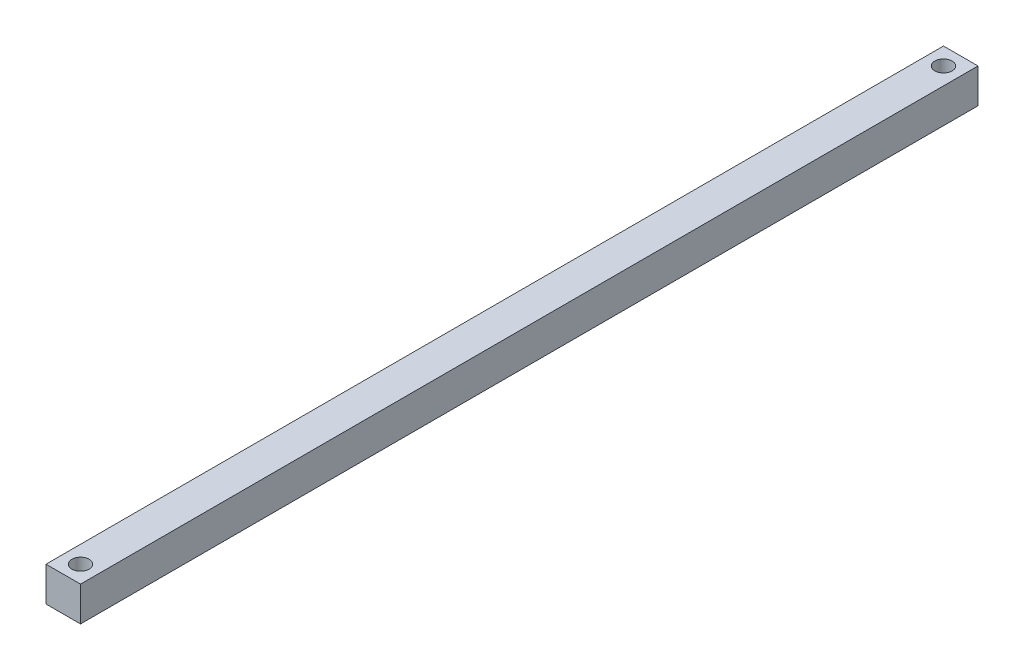
ISO-10303-21;
HEADER;
FILE_DESCRIPTION(('STEP AP214'),'2;1');
FILE_NAME('part.step','',(''),(''),'','','');
FILE_SCHEMA(('AUTOMOTIVE_DESIGN { 1 0 10303 214 1 1 1 1 }'));
ENDSEC;
DATA;
#1=APPLICATION_CONTEXT('core data for automotive mechanical design processes');
#2=APPLICATION_PROTOCOL_DEFINITION('international standard','automotive_design',2000,#1);
#3=PRODUCT_CONTEXT('',#1,'mechanical');
#4=PRODUCT('Part','Part','',(#3));
#5=PRODUCT_RELATED_PRODUCT_CATEGORY('part','',(#4));
#6=PRODUCT_DEFINITION_FORMATION('','',#4);
#7=PRODUCT_DEFINITION_CONTEXT('part definition',#1,'design');
#8=PRODUCT_DEFINITION('design','',#6,#7);
#9=PRODUCT_DEFINITION_SHAPE('','',#8);
#10=(LENGTH_UNIT() NAMED_UNIT(*) SI_UNIT(.MILLI.,.METRE.));
#11=(NAMED_UNIT(*) PLANE_ANGLE_UNIT() SI_UNIT($,.RADIAN.));
#12=(NAMED_UNIT(*) SI_UNIT($,.STERADIAN.) SOLID_ANGLE_UNIT());
#13=UNCERTAINTY_MEASURE_WITH_UNIT(LENGTH_MEASURE(1.E-05),#10,'distance_accuracy_value','');
#14=(GEOMETRIC_REPRESENTATION_CONTEXT(3) GLOBAL_UNCERTAINTY_ASSIGNED_CONTEXT((#13)) GLOBAL_UNIT_ASSIGNED_CONTEXT((#10,
#11,#12)) REPRESENTATION_CONTEXT('',''));
#15=CARTESIAN_POINT('',(0.,0.,0.));
#16=DIRECTION('',(0.,0.,1.));
#17=DIRECTION('',(1.,0.,0.));
#18=AXIS2_PLACEMENT_3D('',#15,#16,#17);
#19=CARTESIAN_POINT('',(0.,10.,0.));
#20=DIRECTION('',(-1.,0.,0.));
#21=DIRECTION('',(0.,0.,1.));
#22=AXIS2_PLACEMENT_3D('',#19,#20,#21);
#23=PLANE('',#22);
#24=DIRECTION('',(0.,0.,-1.));
#25=VECTOR('',#24,1.);
#26=CARTESIAN_POINT('',(0.,0.,0.));
#27=LINE('',#26,#25);
#28=CARTESIAN_POINT('',(0.,0.,0.));
#29=VERTEX_POINT('',#28);
#30=CARTESIAN_POINT('',(0.,0.,-260.));
#31=VERTEX_POINT('',#30);
#32=EDGE_CURVE('E95',#29,#31,#27,.T.);
#33=ORIENTED_EDGE('',*,*,#32,.T.);
#34=DIRECTION('',(0.,-1.,0.));
#35=VECTOR('',#34,1.);
#36=CARTESIAN_POINT('',(0.,10.,-260.));
#37=LINE('',#36,#35);
#38=CARTESIAN_POINT('',(0.,10.,-260.));
#39=VERTEX_POINT('',#38);
#40=EDGE_CURVE('E11',#39,#31,#37,.T.);
#41=ORIENTED_EDGE('',*,*,#40,.F.);
#42=DIRECTION('',(0.,0.,-1.));
#43=VECTOR('',#42,1.);
#44=CARTESIAN_POINT('',(0.,10.,0.));
#45=LINE('',#44,#43);
#46=CARTESIAN_POINT('',(0.,10.,0.));
#47=VERTEX_POINT('',#46);
#48=EDGE_CURVE('E83',#47,#39,#45,.T.);
#49=ORIENTED_EDGE('',*,*,#48,.F.);
#50=DIRECTION('',(0.,-1.,0.));
#51=VECTOR('',#50,1.);
#52=CARTESIAN_POINT('',(0.,10.,0.));
#53=LINE('',#52,#51);
#54=EDGE_CURVE('E91',#47,#29,#53,.T.);
#55=ORIENTED_EDGE('',*,*,#54,.T.);
#56=EDGE_LOOP('',(#33,#41,#49,#55));
#57=FACE_BOUND('',#56,.T.);
#58=ADVANCED_FACE('F32',(#57),#23,.F.);
#59=CARTESIAN_POINT('',(0.,10.,-260.));
#60=DIRECTION('',(0.,0.,1.));
#61=DIRECTION('',(1.,0.,0.));
#62=AXIS2_PLACEMENT_3D('',#59,#60,#61);
#63=PLANE('',#62);
#64=DIRECTION('',(-1.,0.,0.));
#65=VECTOR('',#64,1.);
#66=CARTESIAN_POINT('',(0.,0.,-260.));
#67=LINE('',#66,#65);
#68=CARTESIAN_POINT('',(-10.,0.,-260.));
#69=VERTEX_POINT('',#68);
#70=EDGE_CURVE('E87',#31,#69,#67,.T.);
#71=ORIENTED_EDGE('',*,*,#70,.T.);
#72=DIRECTION('',(0.,-1.,0.));
#73=VECTOR('',#72,1.);
#74=CARTESIAN_POINT('',(-10.,10.,-260.));
#75=LINE('',#74,#73);
#76=CARTESIAN_POINT('',(-10.,10.,-260.));
#77=VERTEX_POINT('',#76);
#78=EDGE_CURVE('E40',#77,#69,#75,.T.);
#79=ORIENTED_EDGE('',*,*,#78,.F.);
#80=DIRECTION('',(-1.,0.,0.));
#81=VECTOR('',#80,1.);
#82=CARTESIAN_POINT('',(0.,10.,-260.));
#83=LINE('',#82,#81);
#84=EDGE_CURVE('E78',#39,#77,#83,.T.);
#85=ORIENTED_EDGE('',*,*,#84,.F.);
#86=ORIENTED_EDGE('',*,*,#40,.T.);
#87=EDGE_LOOP('',(#71,#79,#85,#86));
#88=FACE_BOUND('',#87,.T.);
#89=ADVANCED_FACE('F86',(#88),#63,.F.);
#90=CARTESIAN_POINT('',(-10.,10.,0.));
#91=DIRECTION('',(1.,0.,0.));
#92=DIRECTION('',(0.,0.,-1.));
#93=AXIS2_PLACEMENT_3D('',#90,#91,#92);
#94=PLANE('',#93);
#95=DIRECTION('',(0.,0.,1.));
#96=VECTOR('',#95,1.);
#97=CARTESIAN_POINT('',(-10.,0.,0.));
#98=LINE('',#97,#96);
#99=CARTESIAN_POINT('',(-10.,0.,0.));
#100=VERTEX_POINT('',#99);
#101=EDGE_CURVE('E65',#69,#100,#98,.T.);
#102=ORIENTED_EDGE('',*,*,#101,.T.);
#103=DIRECTION('',(0.,-1.,0.));
#104=VECTOR('',#103,1.);
#105=CARTESIAN_POINT('',(-10.,10.,0.));
#106=LINE('',#105,#104);
#107=CARTESIAN_POINT('',(-10.,10.,0.));
#108=VERTEX_POINT('',#107);
#109=EDGE_CURVE('E88',#108,#100,#106,.T.);
#110=ORIENTED_EDGE('',*,*,#109,.F.);
#111=DIRECTION('',(0.,0.,1.));
#112=VECTOR('',#111,1.);
#113=CARTESIAN_POINT('',(-10.,10.,0.));
#114=LINE('',#113,#112);
#115=EDGE_CURVE('E81',#77,#108,#114,.T.);
#116=ORIENTED_EDGE('',*,*,#115,.F.);
#117=ORIENTED_EDGE('',*,*,#78,.T.);
#118=EDGE_LOOP('',(#102,#110,#116,#117));
#119=FACE_BOUND('',#118,.T.);
#120=ADVANCED_FACE('F89',(#119),#94,.F.);
#121=CARTESIAN_POINT('',(0.,10.,0.));
#122=DIRECTION('',(0.,0.,-1.));
#123=DIRECTION('',(-1.,0.,0.));
#124=AXIS2_PLACEMENT_3D('',#121,#122,#123);
#125=PLANE('',#124);
#126=DIRECTION('',(1.,0.,0.));
#127=VECTOR('',#126,1.);
#128=CARTESIAN_POINT('',(0.,0.,0.));
#129=LINE('',#128,#127);
#130=EDGE_CURVE('E71',#100,#29,#129,.T.);
#131=ORIENTED_EDGE('',*,*,#130,.T.);
#132=ORIENTED_EDGE('',*,*,#54,.F.);
#133=DIRECTION('',(1.,0.,0.));
#134=VECTOR('',#133,1.);
#135=CARTESIAN_POINT('',(0.,10.,0.));
#136=LINE('',#135,#134);
#137=EDGE_CURVE('E48',#108,#47,#136,.T.);
#138=ORIENTED_EDGE('',*,*,#137,.F.);
#139=ORIENTED_EDGE('',*,*,#109,.T.);
#140=EDGE_LOOP('',(#131,#132,#138,#139));
#141=FACE_BOUND('',#140,.T.);
#142=ADVANCED_FACE('F103',(#141),#125,.F.);
#143=CARTESIAN_POINT('',(0.,10.,0.));
#144=DIRECTION('',(0.,1.,0.));
#145=DIRECTION('',(0.,0.,1.));
#146=AXIS2_PLACEMENT_3D('',#143,#144,#145);
#147=PLANE('',#146);
#148=CARTESIAN_POINT('',(-5.,10.,-5.));
#149=DIRECTION('',(0.,1.,0.));
#150=DIRECTION('',(0.,0.,1.));
#151=AXIS2_PLACEMENT_3D('',#148,#149,#150);
#152=CIRCLE('',#151,2.5);
#153=CARTESIAN_POINT('',(-5.,10.,-2.5));
#154=VERTEX_POINT('',#153);
#155=EDGE_CURVE('E115',#154,#154,#152,.T.);
#156=ORIENTED_EDGE('',*,*,#155,.F.);
#157=EDGE_LOOP('',(#156));
#158=FACE_BOUND('',#157,.T.);
#159=CARTESIAN_POINT('',(-5.,10.,-255.));
#160=DIRECTION('',(0.,1.,0.));
#161=DIRECTION('',(0.,0.,1.));
#162=AXIS2_PLACEMENT_3D('',#159,#160,#161);
#163=CIRCLE('',#162,2.5);
#164=CARTESIAN_POINT('',(-5.,10.,-252.5));
#165=VERTEX_POINT('',#164);
#166=EDGE_CURVE('E109',#165,#165,#163,.T.);
#167=ORIENTED_EDGE('',*,*,#166,.F.);
#168=EDGE_LOOP('',(#167));
#169=FACE_BOUND('',#168,.T.);
#170=ORIENTED_EDGE('',*,*,#48,.T.);
#171=ORIENTED_EDGE('',*,*,#84,.T.);
#172=ORIENTED_EDGE('',*,*,#115,.T.);
#173=ORIENTED_EDGE('',*,*,#137,.T.);
#174=EDGE_LOOP('',(#170,#171,#172,#173));
#175=FACE_BOUND('',#174,.T.);
#176=ADVANCED_FACE('F79',(#158,#169,#175),#147,.T.);
#177=CARTESIAN_POINT('',(0.,0.,0.));
#178=DIRECTION('',(0.,1.,0.));
#179=DIRECTION('',(0.,0.,1.));
#180=AXIS2_PLACEMENT_3D('',#177,#178,#179);
#181=PLANE('',#180);
#182=CARTESIAN_POINT('',(-5.,0.,-5.));
#183=DIRECTION('',(0.,1.,0.));
#184=DIRECTION('',(0.,0.,1.));
#185=AXIS2_PLACEMENT_3D('',#182,#183,#184);
#186=CIRCLE('',#185,2.5);
#187=CARTESIAN_POINT('',(-5.,0.,-2.5));
#188=VERTEX_POINT('',#187);
#189=EDGE_CURVE('E112',#188,#188,#186,.T.);
#190=ORIENTED_EDGE('',*,*,#189,.T.);
#191=EDGE_LOOP('',(#190));
#192=FACE_BOUND('',#191,.T.);
#193=CARTESIAN_POINT('',(-5.,0.,-255.));
#194=DIRECTION('',(0.,1.,0.));
#195=DIRECTION('',(0.,0.,1.));
#196=AXIS2_PLACEMENT_3D('',#193,#194,#195);
#197=CIRCLE('',#196,2.5);
#198=CARTESIAN_POINT('',(-5.,0.,-252.5));
#199=VERTEX_POINT('',#198);
#200=EDGE_CURVE('E98',#199,#199,#197,.T.);
#201=ORIENTED_EDGE('',*,*,#200,.T.);
#202=EDGE_LOOP('',(#201));
#203=FACE_BOUND('',#202,.T.);
#204=ORIENTED_EDGE('',*,*,#32,.F.);
#205=ORIENTED_EDGE('',*,*,#130,.F.);
#206=ORIENTED_EDGE('',*,*,#101,.F.);
#207=ORIENTED_EDGE('',*,*,#70,.F.);
#208=EDGE_LOOP('',(#204,#205,#206,#207));
#209=FACE_BOUND('',#208,.T.);
#210=ADVANCED_FACE('F106',(#192,#203,#209),#181,.F.);
#211=CARTESIAN_POINT('',(-5.,0.,-255.));
#212=DIRECTION('',(0.,1.,0.));
#213=DIRECTION('',(0.,0.,1.));
#214=AXIS2_PLACEMENT_3D('',#211,#212,#213);
#215=CYLINDRICAL_SURFACE('',#214,2.5);
#216=ORIENTED_EDGE('',*,*,#200,.F.);
#217=EDGE_LOOP('',(#216));
#218=FACE_BOUND('',#217,.T.);
#219=ORIENTED_EDGE('',*,*,#166,.T.);
#220=EDGE_LOOP('',(#219));
#221=FACE_BOUND('',#220,.T.);
#222=ADVANCED_FACE('F126',(#218,#221),#215,.F.);
#223=CARTESIAN_POINT('',(-5.,0.,-5.));
#224=DIRECTION('',(0.,1.,0.));
#225=DIRECTION('',(0.,0.,1.));
#226=AXIS2_PLACEMENT_3D('',#223,#224,#225);
#227=CYLINDRICAL_SURFACE('',#226,2.5);
#228=ORIENTED_EDGE('',*,*,#189,.F.);
#229=EDGE_LOOP('',(#228));
#230=FACE_BOUND('',#229,.T.);
#231=ORIENTED_EDGE('',*,*,#155,.T.);
#232=EDGE_LOOP('',(#231));
#233=FACE_BOUND('',#232,.T.);
#234=ADVANCED_FACE('F123',(#230,#233),#227,.F.);
#235=CLOSED_SHELL('',(#58,#89,#120,#142,#176,#210,#222,#234));
#236=MANIFOLD_SOLID_BREP('B2',#235);
#237=ADVANCED_BREP_SHAPE_REPRESENTATION('',(#18,#236),#14);
#238=SHAPE_DEFINITION_REPRESENTATION(#9,#237);
ENDSEC;
END-ISO-10303-21;
